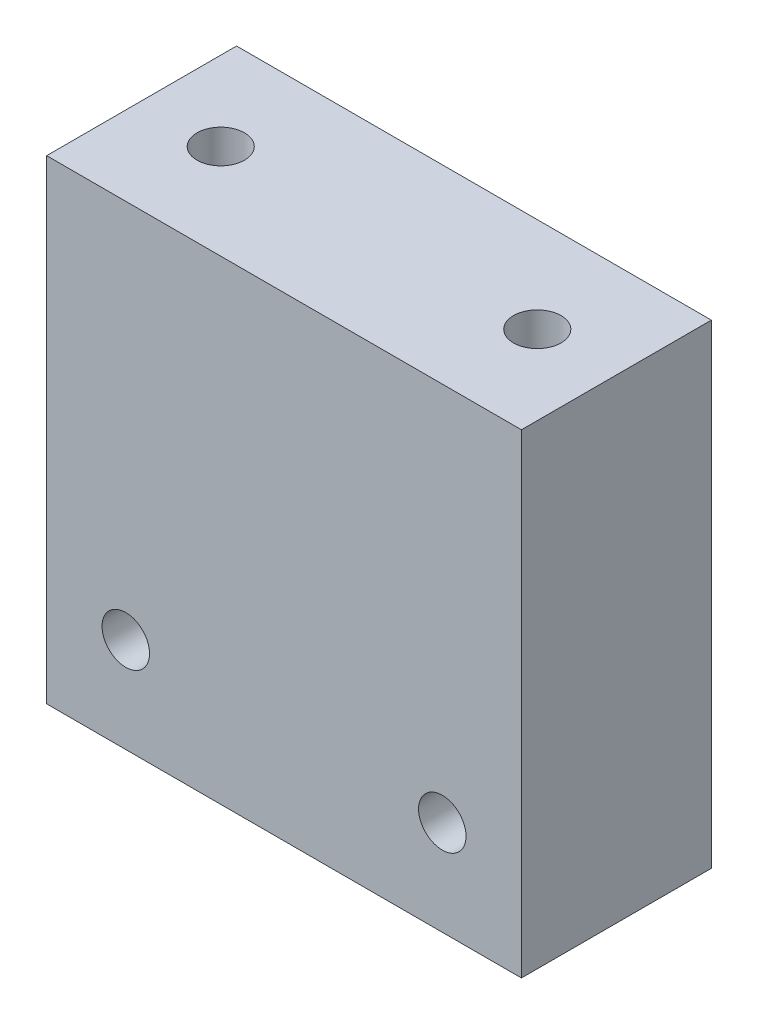
ISO-10303-21;
HEADER;
FILE_DESCRIPTION(('STEP AP214'),'2;1');
FILE_NAME('part.step','',(''),(''),'','','');
FILE_SCHEMA(('AUTOMOTIVE_DESIGN { 1 0 10303 214 1 1 1 1 }'));
ENDSEC;
DATA;
#1=APPLICATION_CONTEXT('core data for automotive mechanical design processes');
#2=APPLICATION_PROTOCOL_DEFINITION('international standard','automotive_design',2000,#1);
#3=PRODUCT_CONTEXT('',#1,'mechanical');
#4=PRODUCT('Part','Part','',(#3));
#5=PRODUCT_RELATED_PRODUCT_CATEGORY('part','',(#4));
#6=PRODUCT_DEFINITION_FORMATION('','',#4);
#7=PRODUCT_DEFINITION_CONTEXT('part definition',#1,'design');
#8=PRODUCT_DEFINITION('design','',#6,#7);
#9=PRODUCT_DEFINITION_SHAPE('','',#8);
#10=(LENGTH_UNIT() NAMED_UNIT(*) SI_UNIT(.MILLI.,.METRE.));
#11=(NAMED_UNIT(*) PLANE_ANGLE_UNIT() SI_UNIT($,.RADIAN.));
#12=(NAMED_UNIT(*) SI_UNIT($,.STERADIAN.) SOLID_ANGLE_UNIT());
#13=UNCERTAINTY_MEASURE_WITH_UNIT(LENGTH_MEASURE(1.E-05),#10,'distance_accuracy_value','');
#14=(GEOMETRIC_REPRESENTATION_CONTEXT(3) GLOBAL_UNCERTAINTY_ASSIGNED_CONTEXT((#13)) GLOBAL_UNIT_ASSIGNED_CONTEXT((#10,
#11,#12)) REPRESENTATION_CONTEXT('',''));
#15=CARTESIAN_POINT('',(0.,0.,0.));
#16=DIRECTION('',(0.,0.,1.));
#17=DIRECTION('',(1.,0.,0.));
#18=AXIS2_PLACEMENT_3D('',#15,#16,#17);
#19=CARTESIAN_POINT('',(0.,0.,12.));
#20=DIRECTION('',(1.,0.,0.));
#21=DIRECTION('',(0.,0.,-1.));
#22=AXIS2_PLACEMENT_3D('',#19,#20,#21);
#23=PLANE('',#22);
#24=DIRECTION('',(0.,-1.,0.));
#25=VECTOR('',#24,1.);
#26=CARTESIAN_POINT('',(0.,0.,0.));
#27=LINE('',#26,#25);
#28=CARTESIAN_POINT('',(0.,30.,0.));
#29=VERTEX_POINT('',#28);
#30=CARTESIAN_POINT('',(0.,0.,0.));
#31=VERTEX_POINT('',#30);
#32=EDGE_CURVE('E98',#29,#31,#27,.T.);
#33=ORIENTED_EDGE('',*,*,#32,.T.);
#34=DIRECTION('',(0.,0.,-1.));
#35=VECTOR('',#34,1.);
#36=CARTESIAN_POINT('',(0.,0.,12.));
#37=LINE('',#36,#35);
#38=CARTESIAN_POINT('',(0.,0.,12.));
#39=VERTEX_POINT('',#38);
#40=EDGE_CURVE('E12',#39,#31,#37,.T.);
#41=ORIENTED_EDGE('',*,*,#40,.F.);
#42=DIRECTION('',(0.,-1.,0.));
#43=VECTOR('',#42,1.);
#44=CARTESIAN_POINT('',(0.,0.,12.));
#45=LINE('',#44,#43);
#46=CARTESIAN_POINT('',(0.,30.,12.));
#47=VERTEX_POINT('',#46);
#48=EDGE_CURVE('E86',#47,#39,#45,.T.);
#49=ORIENTED_EDGE('',*,*,#48,.F.);
#50=DIRECTION('',(0.,0.,-1.));
#51=VECTOR('',#50,1.);
#52=CARTESIAN_POINT('',(0.,30.,12.));
#53=LINE('',#52,#51);
#54=EDGE_CURVE('E94',#47,#29,#53,.T.);
#55=ORIENTED_EDGE('',*,*,#54,.T.);
#56=EDGE_LOOP('',(#33,#41,#49,#55));
#57=FACE_BOUND('',#56,.T.);
#58=ADVANCED_FACE('F35',(#57),#23,.F.);
#59=CARTESIAN_POINT('',(0.,0.,12.));
#60=DIRECTION('',(0.,1.,0.));
#61=DIRECTION('',(0.,0.,1.));
#62=AXIS2_PLACEMENT_3D('',#59,#60,#61);
#63=PLANE('',#62);
#64=DIRECTION('',(1.,0.,0.));
#65=VECTOR('',#64,1.);
#66=CARTESIAN_POINT('',(0.,0.,0.));
#67=LINE('',#66,#65);
#68=CARTESIAN_POINT('',(30.,0.,0.));
#69=VERTEX_POINT('',#68);
#70=EDGE_CURVE('E90',#31,#69,#67,.T.);
#71=ORIENTED_EDGE('',*,*,#70,.T.);
#72=DIRECTION('',(0.,0.,-1.));
#73=VECTOR('',#72,1.);
#74=CARTESIAN_POINT('',(30.,0.,12.));
#75=LINE('',#74,#73);
#76=CARTESIAN_POINT('',(30.,0.,12.));
#77=VERTEX_POINT('',#76);
#78=EDGE_CURVE('E43',#77,#69,#75,.T.);
#79=ORIENTED_EDGE('',*,*,#78,.F.);
#80=DIRECTION('',(1.,0.,0.));
#81=VECTOR('',#80,1.);
#82=CARTESIAN_POINT('',(0.,0.,12.));
#83=LINE('',#82,#81);
#84=EDGE_CURVE('E81',#39,#77,#83,.T.);
#85=ORIENTED_EDGE('',*,*,#84,.F.);
#86=ORIENTED_EDGE('',*,*,#40,.T.);
#87=EDGE_LOOP('',(#71,#79,#85,#86));
#88=FACE_BOUND('',#87,.T.);
#89=ADVANCED_FACE('F89',(#88),#63,.F.);
#90=CARTESIAN_POINT('',(30.,0.,12.));
#91=DIRECTION('',(-1.,0.,0.));
#92=DIRECTION('',(0.,0.,1.));
#93=AXIS2_PLACEMENT_3D('',#90,#91,#92);
#94=PLANE('',#93);
#95=DIRECTION('',(0.,1.,0.));
#96=VECTOR('',#95,1.);
#97=CARTESIAN_POINT('',(30.,0.,0.));
#98=LINE('',#97,#96);
#99=CARTESIAN_POINT('',(30.,30.,0.));
#100=VERTEX_POINT('',#99);
#101=EDGE_CURVE('E68',#69,#100,#98,.T.);
#102=ORIENTED_EDGE('',*,*,#101,.T.);
#103=DIRECTION('',(0.,0.,-1.));
#104=VECTOR('',#103,1.);
#105=CARTESIAN_POINT('',(30.,30.,12.));
#106=LINE('',#105,#104);
#107=CARTESIAN_POINT('',(30.,30.,12.));
#108=VERTEX_POINT('',#107);
#109=EDGE_CURVE('E91',#108,#100,#106,.T.);
#110=ORIENTED_EDGE('',*,*,#109,.F.);
#111=DIRECTION('',(0.,1.,0.));
#112=VECTOR('',#111,1.);
#113=CARTESIAN_POINT('',(30.,0.,12.));
#114=LINE('',#113,#112);
#115=EDGE_CURVE('E84',#77,#108,#114,.T.);
#116=ORIENTED_EDGE('',*,*,#115,.F.);
#117=ORIENTED_EDGE('',*,*,#78,.T.);
#118=EDGE_LOOP('',(#102,#110,#116,#117));
#119=FACE_BOUND('',#118,.T.);
#120=ADVANCED_FACE('F92',(#119),#94,.F.);
#121=CARTESIAN_POINT('',(0.,30.,12.));
#122=DIRECTION('',(0.,-1.,0.));
#123=DIRECTION('',(0.,0.,-1.));
#124=AXIS2_PLACEMENT_3D('',#121,#122,#123);
#125=PLANE('',#124);
#126=CARTESIAN_POINT('',(25.,30.,6.));
#127=DIRECTION('',(0.,1.,0.));
#128=DIRECTION('',(0.,0.,-1.));
#129=AXIS2_PLACEMENT_3D('',#126,#127,#128);
#130=CIRCLE('',#129,1.5);
#131=CARTESIAN_POINT('',(25.,30.,4.5));
#132=VERTEX_POINT('',#131);
#133=EDGE_CURVE('E131',#132,#132,#130,.T.);
#134=ORIENTED_EDGE('',*,*,#133,.F.);
#135=EDGE_LOOP('',(#134));
#136=FACE_BOUND('',#135,.T.);
#137=CARTESIAN_POINT('',(5.,30.,6.));
#138=DIRECTION('',(0.,1.,0.));
#139=DIRECTION('',(0.,0.,1.));
#140=AXIS2_PLACEMENT_3D('',#137,#138,#139);
#141=CIRCLE('',#140,1.5);
#142=CARTESIAN_POINT('',(5.,30.,7.5));
#143=VERTEX_POINT('',#142);
#144=EDGE_CURVE('E125',#143,#143,#141,.T.);
#145=ORIENTED_EDGE('',*,*,#144,.F.);
#146=EDGE_LOOP('',(#145));
#147=FACE_BOUND('',#146,.T.);
#148=DIRECTION('',(-1.,0.,0.));
#149=VECTOR('',#148,1.);
#150=CARTESIAN_POINT('',(0.,30.,0.));
#151=LINE('',#150,#149);
#152=EDGE_CURVE('E74',#100,#29,#151,.T.);
#153=ORIENTED_EDGE('',*,*,#152,.T.);
#154=ORIENTED_EDGE('',*,*,#54,.F.);
#155=DIRECTION('',(-1.,0.,0.));
#156=VECTOR('',#155,1.);
#157=CARTESIAN_POINT('',(0.,30.,12.));
#158=LINE('',#157,#156);
#159=EDGE_CURVE('E51',#108,#47,#158,.T.);
#160=ORIENTED_EDGE('',*,*,#159,.F.);
#161=ORIENTED_EDGE('',*,*,#109,.T.);
#162=EDGE_LOOP('',(#153,#154,#160,#161));
#163=FACE_BOUND('',#162,.T.);
#164=ADVANCED_FACE('F106',(#136,#147,#163),#125,.F.);
#165=CARTESIAN_POINT('',(0.,0.,12.));
#166=DIRECTION('',(0.,0.,-1.));
#167=DIRECTION('',(-1.,0.,0.));
#168=AXIS2_PLACEMENT_3D('',#165,#166,#167);
#169=PLANE('',#168);
#170=CARTESIAN_POINT('',(25.,6.,12.));
#171=DIRECTION('',(0.,0.,1.));
#172=DIRECTION('',(-1.,0.,0.));
#173=AXIS2_PLACEMENT_3D('',#170,#171,#172);
#174=CIRCLE('',#173,1.5);
#175=CARTESIAN_POINT('',(23.5,6.,12.));
#176=VERTEX_POINT('',#175);
#177=EDGE_CURVE('E118',#176,#176,#174,.T.);
#178=ORIENTED_EDGE('',*,*,#177,.F.);
#179=EDGE_LOOP('',(#178));
#180=FACE_BOUND('',#179,.T.);
#181=CARTESIAN_POINT('',(5.,6.,12.));
#182=DIRECTION('',(0.,0.,1.));
#183=DIRECTION('',(1.,0.,0.));
#184=AXIS2_PLACEMENT_3D('',#181,#182,#183);
#185=CIRCLE('',#184,1.5);
#186=CARTESIAN_POINT('',(6.5,6.,12.));
#187=VERTEX_POINT('',#186);
#188=EDGE_CURVE('E112',#187,#187,#185,.T.);
#189=ORIENTED_EDGE('',*,*,#188,.F.);
#190=EDGE_LOOP('',(#189));
#191=FACE_BOUND('',#190,.T.);
#192=ORIENTED_EDGE('',*,*,#48,.T.);
#193=ORIENTED_EDGE('',*,*,#84,.T.);
#194=ORIENTED_EDGE('',*,*,#115,.T.);
#195=ORIENTED_EDGE('',*,*,#159,.T.);
#196=EDGE_LOOP('',(#192,#193,#194,#195));
#197=FACE_BOUND('',#196,.T.);
#198=ADVANCED_FACE('F82',(#180,#191,#197),#169,.F.);
#199=CARTESIAN_POINT('',(0.,0.,0.));
#200=DIRECTION('',(0.,0.,-1.));
#201=DIRECTION('',(-1.,0.,0.));
#202=AXIS2_PLACEMENT_3D('',#199,#200,#201);
#203=PLANE('',#202);
#204=CARTESIAN_POINT('',(25.,6.,0.));
#205=DIRECTION('',(0.,0.,1.));
#206=DIRECTION('',(-1.,0.,0.));
#207=AXIS2_PLACEMENT_3D('',#204,#205,#206);
#208=CIRCLE('',#207,1.5);
#209=CARTESIAN_POINT('',(23.5,6.,0.));
#210=VERTEX_POINT('',#209);
#211=EDGE_CURVE('E116',#210,#210,#208,.T.);
#212=ORIENTED_EDGE('',*,*,#211,.T.);
#213=EDGE_LOOP('',(#212));
#214=FACE_BOUND('',#213,.T.);
#215=CARTESIAN_POINT('',(5.,6.,0.));
#216=DIRECTION('',(0.,0.,1.));
#217=DIRECTION('',(1.,0.,0.));
#218=AXIS2_PLACEMENT_3D('',#215,#216,#217);
#219=CIRCLE('',#218,1.5);
#220=CARTESIAN_POINT('',(6.5,6.,0.));
#221=VERTEX_POINT('',#220);
#222=EDGE_CURVE('E101',#221,#221,#219,.T.);
#223=ORIENTED_EDGE('',*,*,#222,.T.);
#224=EDGE_LOOP('',(#223));
#225=FACE_BOUND('',#224,.T.);
#226=ORIENTED_EDGE('',*,*,#32,.F.);
#227=ORIENTED_EDGE('',*,*,#152,.F.);
#228=ORIENTED_EDGE('',*,*,#101,.F.);
#229=ORIENTED_EDGE('',*,*,#70,.F.);
#230=EDGE_LOOP('',(#226,#227,#228,#229));
#231=FACE_BOUND('',#230,.T.);
#232=ADVANCED_FACE('F109',(#214,#225,#231),#203,.T.);
#233=CARTESIAN_POINT('',(5.,6.,0.));
#234=DIRECTION('',(0.,0.,1.));
#235=DIRECTION('',(1.,0.,0.));
#236=AXIS2_PLACEMENT_3D('',#233,#234,#235);
#237=CYLINDRICAL_SURFACE('',#236,1.5);
#238=ORIENTED_EDGE('',*,*,#222,.F.);
#239=EDGE_LOOP('',(#238));
#240=FACE_BOUND('',#239,.T.);
#241=ORIENTED_EDGE('',*,*,#188,.T.);
#242=EDGE_LOOP('',(#241));
#243=FACE_BOUND('',#242,.T.);
#244=ADVANCED_FACE('F162',(#240,#243),#237,.F.);
#245=CARTESIAN_POINT('',(25.,6.,0.));
#246=DIRECTION('',(0.,0.,1.));
#247=DIRECTION('',(1.,0.,0.));
#248=AXIS2_PLACEMENT_3D('',#245,#246,#247);
#249=CYLINDRICAL_SURFACE('',#248,1.5);
#250=ORIENTED_EDGE('',*,*,#211,.F.);
#251=EDGE_LOOP('',(#250));
#252=FACE_BOUND('',#251,.T.);
#253=ORIENTED_EDGE('',*,*,#177,.T.);
#254=EDGE_LOOP('',(#253));
#255=FACE_BOUND('',#254,.T.);
#256=ADVANCED_FACE('F153',(#252,#255),#249,.F.);
#257=CARTESIAN_POINT('',(5.,25.,6.));
#258=DIRECTION('',(0.,1.,0.));
#259=DIRECTION('',(0.,0.,1.));
#260=AXIS2_PLACEMENT_3D('',#257,#258,#259);
#261=CYLINDRICAL_SURFACE('',#260,1.5);
#262=CARTESIAN_POINT('',(5.,25.,6.));
#263=DIRECTION('',(0.,1.,0.));
#264=DIRECTION('',(0.,0.,1.));
#265=AXIS2_PLACEMENT_3D('',#262,#263,#264);
#266=CIRCLE('',#265,1.5);
#267=CARTESIAN_POINT('',(5.,25.,7.5));
#268=VERTEX_POINT('',#267);
#269=EDGE_CURVE('E122',#268,#268,#266,.T.);
#270=ORIENTED_EDGE('',*,*,#269,.F.);
#271=EDGE_LOOP('',(#270));
#272=FACE_BOUND('',#271,.T.);
#273=ORIENTED_EDGE('',*,*,#144,.T.);
#274=EDGE_LOOP('',(#273));
#275=FACE_BOUND('',#274,.T.);
#276=ADVANCED_FACE('F151',(#272,#275),#261,.F.);
#277=CARTESIAN_POINT('',(5.,25.,6.));
#278=DIRECTION('',(0.,1.,0.));
#279=DIRECTION('',(0.,0.,1.));
#280=AXIS2_PLACEMENT_3D('',#277,#278,#279);
#281=PLANE('',#280);
#282=ORIENTED_EDGE('',*,*,#269,.T.);
#283=EDGE_LOOP('',(#282));
#284=FACE_BOUND('',#283,.T.);
#285=ADVANCED_FACE('F142',(#284),#281,.T.);
#286=CARTESIAN_POINT('',(25.,25.,6.));
#287=DIRECTION('',(0.,1.,0.));
#288=DIRECTION('',(0.,0.,1.));
#289=AXIS2_PLACEMENT_3D('',#286,#287,#288);
#290=CYLINDRICAL_SURFACE('',#289,1.5);
#291=CARTESIAN_POINT('',(25.,25.,6.));
#292=DIRECTION('',(0.,1.,0.));
#293=DIRECTION('',(0.,0.,-1.));
#294=AXIS2_PLACEMENT_3D('',#291,#292,#293);
#295=CIRCLE('',#294,1.5);
#296=CARTESIAN_POINT('',(25.,25.,4.5));
#297=VERTEX_POINT('',#296);
#298=EDGE_CURVE('E128',#297,#297,#295,.T.);
#299=ORIENTED_EDGE('',*,*,#298,.F.);
#300=EDGE_LOOP('',(#299));
#301=FACE_BOUND('',#300,.T.);
#302=ORIENTED_EDGE('',*,*,#133,.T.);
#303=EDGE_LOOP('',(#302));
#304=FACE_BOUND('',#303,.T.);
#305=ADVANCED_FACE('F139',(#301,#304),#290,.F.);
#306=CARTESIAN_POINT('',(25.,25.,6.));
#307=DIRECTION('',(0.,-1.,0.));
#308=DIRECTION('',(0.,0.,-1.));
#309=AXIS2_PLACEMENT_3D('',#306,#307,#308);
#310=PLANE('',#309);
#311=ORIENTED_EDGE('',*,*,#298,.T.);
#312=EDGE_LOOP('',(#311));
#313=FACE_BOUND('',#312,.T.);
#314=ADVANCED_FACE('F137',(#313),#310,.F.);
#315=CLOSED_SHELL('',(#58,#89,#120,#164,#198,#232,#244,#256,#276,#285,#305,#314));
#316=MANIFOLD_SOLID_BREP('B2',#315);
#317=ADVANCED_BREP_SHAPE_REPRESENTATION('',(#18,#316),#14);
#318=SHAPE_DEFINITION_REPRESENTATION(#9,#317);
ENDSEC;
END-ISO-10303-21;
